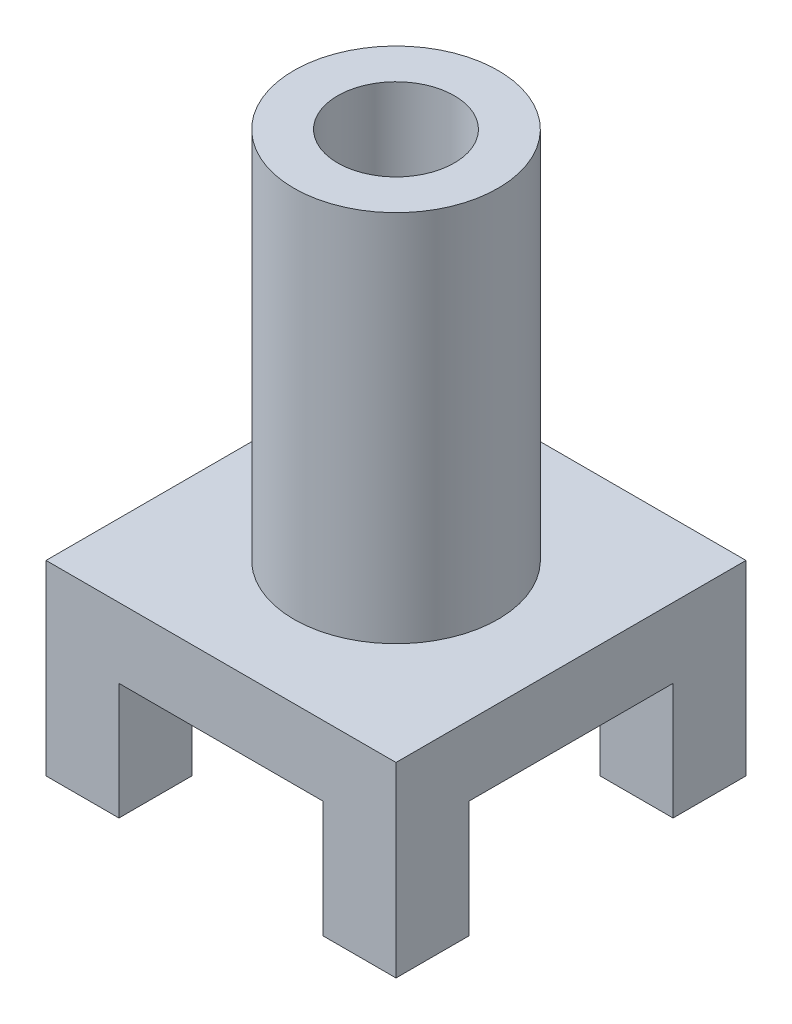
ISO-10303-21;
HEADER;
FILE_DESCRIPTION(('STEP AP214'),'2;1');
FILE_NAME('part.step','',(''),(''),'','','');
FILE_SCHEMA(('AUTOMOTIVE_DESIGN { 1 0 10303 214 1 1 1 1 }'));
ENDSEC;
DATA;
#1=APPLICATION_CONTEXT('core data for automotive mechanical design processes');
#2=APPLICATION_PROTOCOL_DEFINITION('international standard','automotive_design',2000,#1);
#3=PRODUCT_CONTEXT('',#1,'mechanical');
#4=PRODUCT('Part','Part','',(#3));
#5=PRODUCT_RELATED_PRODUCT_CATEGORY('part','',(#4));
#6=PRODUCT_DEFINITION_FORMATION('','',#4);
#7=PRODUCT_DEFINITION_CONTEXT('part definition',#1,'design');
#8=PRODUCT_DEFINITION('design','',#6,#7);
#9=PRODUCT_DEFINITION_SHAPE('','',#8);
#10=(LENGTH_UNIT() NAMED_UNIT(*) SI_UNIT(.MILLI.,.METRE.));
#11=(NAMED_UNIT(*) PLANE_ANGLE_UNIT() SI_UNIT($,.RADIAN.));
#12=(NAMED_UNIT(*) SI_UNIT($,.STERADIAN.) SOLID_ANGLE_UNIT());
#13=UNCERTAINTY_MEASURE_WITH_UNIT(LENGTH_MEASURE(1.E-05),#10,'distance_accuracy_value','');
#14=(GEOMETRIC_REPRESENTATION_CONTEXT(3) GLOBAL_UNCERTAINTY_ASSIGNED_CONTEXT((#13)) GLOBAL_UNIT_ASSIGNED_CONTEXT((#10,
#11,#12)) REPRESENTATION_CONTEXT('',''));
#15=CARTESIAN_POINT('',(0.,0.,0.));
#16=DIRECTION('',(0.,0.,1.));
#17=DIRECTION('',(1.,0.,0.));
#18=AXIS2_PLACEMENT_3D('',#15,#16,#17);
#19=CARTESIAN_POINT('',(0.,0.,0.));
#20=DIRECTION('',(0.,1.,0.));
#21=DIRECTION('',(0.,0.,1.));
#22=AXIS2_PLACEMENT_3D('',#19,#20,#21);
#23=PLANE('',#22);
#24=DIRECTION('',(0.,0.,1.));
#25=VECTOR('',#24,1.);
#26=CARTESIAN_POINT('',(-30.,0.,-30.));
#27=LINE('',#26,#25);
#28=CARTESIAN_POINT('',(-30.,0.,17.5));
#29=VERTEX_POINT('',#28);
#30=CARTESIAN_POINT('',(-30.,0.,30.));
#31=VERTEX_POINT('',#30);
#32=EDGE_CURVE('E173',#29,#31,#27,.T.);
#33=ORIENTED_EDGE('',*,*,#32,.F.);
#34=DIRECTION('',(1.,0.,0.));
#35=VECTOR('',#34,1.);
#36=CARTESIAN_POINT('',(-30.,0.,17.5));
#37=LINE('',#36,#35);
#38=CARTESIAN_POINT('',(-17.5,0.,17.5));
#39=VERTEX_POINT('',#38);
#40=EDGE_CURVE('E156',#29,#39,#37,.T.);
#41=ORIENTED_EDGE('',*,*,#40,.T.);
#42=DIRECTION('',(0.,0.,1.));
#43=VECTOR('',#42,1.);
#44=CARTESIAN_POINT('',(-17.5,0.,-30.));
#45=LINE('',#44,#43);
#46=CARTESIAN_POINT('',(-17.5,0.,30.));
#47=VERTEX_POINT('',#46);
#48=EDGE_CURVE('E246',#39,#47,#45,.T.);
#49=ORIENTED_EDGE('',*,*,#48,.T.);
#50=DIRECTION('',(1.,0.,0.));
#51=VECTOR('',#50,1.);
#52=CARTESIAN_POINT('',(-30.,0.,30.));
#53=LINE('',#52,#51);
#54=EDGE_CURVE('E184',#31,#47,#53,.T.);
#55=ORIENTED_EDGE('',*,*,#54,.F.);
#56=EDGE_LOOP('',(#33,#41,#49,#55));
#57=FACE_BOUND('',#56,.T.);
#58=ADVANCED_FACE('F41',(#57),#23,.F.);
#59=DIRECTION('',(0.,0.,1.));
#60=VECTOR('',#59,1.);
#61=CARTESIAN_POINT('',(17.5,0.,-30.));
#62=LINE('',#61,#60);
#63=CARTESIAN_POINT('',(17.5,0.,17.5));
#64=VERTEX_POINT('',#63);
#65=CARTESIAN_POINT('',(17.5,0.,30.));
#66=VERTEX_POINT('',#65);
#67=EDGE_CURVE('E228',#64,#66,#62,.T.);
#68=ORIENTED_EDGE('',*,*,#67,.F.);
#69=CARTESIAN_POINT('',(30.,0.,17.5));
#70=VERTEX_POINT('',#69);
#71=EDGE_CURVE('E168',#64,#70,#37,.T.);
#72=ORIENTED_EDGE('',*,*,#71,.T.);
#73=DIRECTION('',(0.,0.,-1.));
#74=VECTOR('',#73,1.);
#75=CARTESIAN_POINT('',(30.,0.,-30.));
#76=LINE('',#75,#74);
#77=CARTESIAN_POINT('',(30.,0.,30.));
#78=VERTEX_POINT('',#77);
#79=EDGE_CURVE('E262',#78,#70,#76,.T.);
#80=ORIENTED_EDGE('',*,*,#79,.F.);
#81=EDGE_CURVE('E192',#66,#78,#53,.T.);
#82=ORIENTED_EDGE('',*,*,#81,.F.);
#83=EDGE_LOOP('',(#68,#72,#80,#82));
#84=FACE_BOUND('',#83,.T.);
#85=ADVANCED_FACE('F236',(#84),#23,.F.);
#86=CARTESIAN_POINT('',(-17.5,0.,-30.));
#87=DIRECTION('',(-1.,0.,0.));
#88=DIRECTION('',(0.,0.,1.));
#89=AXIS2_PLACEMENT_3D('',#86,#87,#88);
#90=PLANE('',#89);
#91=ORIENTED_EDGE('',*,*,#48,.F.);
#92=DIRECTION('',(0.,1.,0.));
#93=VECTOR('',#92,1.);
#94=CARTESIAN_POINT('',(-17.5,0.,17.5));
#95=LINE('',#94,#93);
#96=CARTESIAN_POINT('',(-17.5,20.,17.5));
#97=VERTEX_POINT('',#96);
#98=EDGE_CURVE('E162',#39,#97,#95,.T.);
#99=ORIENTED_EDGE('',*,*,#98,.T.);
#100=DIRECTION('',(0.,0.,1.));
#101=VECTOR('',#100,1.);
#102=CARTESIAN_POINT('',(-17.5,20.,-30.));
#103=LINE('',#102,#101);
#104=CARTESIAN_POINT('',(-17.5,20.,30.));
#105=VERTEX_POINT('',#104);
#106=EDGE_CURVE('E276',#97,#105,#103,.T.);
#107=ORIENTED_EDGE('',*,*,#106,.T.);
#108=DIRECTION('',(0.,-1.,0.));
#109=VECTOR('',#108,1.);
#110=CARTESIAN_POINT('',(-17.5,0.,30.));
#111=LINE('',#110,#109);
#112=EDGE_CURVE('E289',#105,#47,#111,.T.);
#113=ORIENTED_EDGE('',*,*,#112,.T.);
#114=EDGE_LOOP('',(#91,#99,#107,#113));
#115=FACE_BOUND('',#114,.T.);
#116=ADVANCED_FACE('F396',(#115),#90,.F.);
#117=CARTESIAN_POINT('',(17.5,0.,-30.));
#118=DIRECTION('',(1.,0.,0.));
#119=DIRECTION('',(0.,0.,-1.));
#120=AXIS2_PLACEMENT_3D('',#117,#118,#119);
#121=PLANE('',#120);
#122=DIRECTION('',(0.,0.,1.));
#123=VECTOR('',#122,1.);
#124=CARTESIAN_POINT('',(17.5,20.,-30.));
#125=LINE('',#124,#123);
#126=CARTESIAN_POINT('',(17.5,20.,17.5));
#127=VERTEX_POINT('',#126);
#128=CARTESIAN_POINT('',(17.5,20.,30.));
#129=VERTEX_POINT('',#128);
#130=EDGE_CURVE('E230',#127,#129,#125,.T.);
#131=ORIENTED_EDGE('',*,*,#130,.F.);
#132=DIRECTION('',(0.,-1.,0.));
#133=VECTOR('',#132,1.);
#134=CARTESIAN_POINT('',(17.5,0.,17.5));
#135=LINE('',#134,#133);
#136=EDGE_CURVE('E45',#127,#64,#135,.T.);
#137=ORIENTED_EDGE('',*,*,#136,.T.);
#138=ORIENTED_EDGE('',*,*,#67,.T.);
#139=DIRECTION('',(0.,1.,0.));
#140=VECTOR('',#139,1.);
#141=CARTESIAN_POINT('',(17.5,0.,30.));
#142=LINE('',#141,#140);
#143=EDGE_CURVE('E286',#66,#129,#142,.T.);
#144=ORIENTED_EDGE('',*,*,#143,.T.);
#145=EDGE_LOOP('',(#131,#137,#138,#144));
#146=FACE_BOUND('',#145,.T.);
#147=ADVANCED_FACE('F226',(#146),#121,.F.);
#148=CARTESIAN_POINT('',(-17.5,0.,-30.));
#149=VERTEX_POINT('',#148);
#150=CARTESIAN_POINT('',(-17.5,0.,-17.5));
#151=VERTEX_POINT('',#150);
#152=EDGE_CURVE('E241',#149,#151,#45,.T.);
#153=ORIENTED_EDGE('',*,*,#152,.T.);
#154=DIRECTION('',(1.,0.,0.));
#155=VECTOR('',#154,1.);
#156=CARTESIAN_POINT('',(-30.,0.,-17.5));
#157=LINE('',#156,#155);
#158=CARTESIAN_POINT('',(-30.,0.,-17.5));
#159=VERTEX_POINT('',#158);
#160=EDGE_CURVE('E58',#159,#151,#157,.T.);
#161=ORIENTED_EDGE('',*,*,#160,.F.);
#162=CARTESIAN_POINT('',(-30.,0.,-30.));
#163=VERTEX_POINT('',#162);
#164=EDGE_CURVE('E186',#163,#159,#27,.T.);
#165=ORIENTED_EDGE('',*,*,#164,.F.);
#166=DIRECTION('',(-1.,0.,0.));
#167=VECTOR('',#166,1.);
#168=CARTESIAN_POINT('',(-30.,0.,-30.));
#169=LINE('',#168,#167);
#170=EDGE_CURVE('E194',#149,#163,#169,.T.);
#171=ORIENTED_EDGE('',*,*,#170,.F.);
#172=EDGE_LOOP('',(#153,#161,#165,#171));
#173=FACE_BOUND('',#172,.T.);
#174=ADVANCED_FACE('F404',(#173),#23,.F.);
#175=CARTESIAN_POINT('',(30.,32.,-30.));
#176=DIRECTION('',(-1.,0.,0.));
#177=DIRECTION('',(0.,0.,1.));
#178=AXIS2_PLACEMENT_3D('',#175,#176,#177);
#179=PLANE('',#178);
#180=ORIENTED_EDGE('',*,*,#79,.T.);
#181=DIRECTION('',(0.,-1.,0.));
#182=VECTOR('',#181,1.);
#183=CARTESIAN_POINT('',(30.,0.,17.5));
#184=LINE('',#183,#182);
#185=CARTESIAN_POINT('',(30.,20.,17.5));
#186=VERTEX_POINT('',#185);
#187=EDGE_CURVE('E325',#186,#70,#184,.T.);
#188=ORIENTED_EDGE('',*,*,#187,.F.);
#189=DIRECTION('',(0.,0.,1.));
#190=VECTOR('',#189,1.);
#191=CARTESIAN_POINT('',(30.,20.,17.5));
#192=LINE('',#191,#190);
#193=CARTESIAN_POINT('',(30.,20.,-17.5));
#194=VERTEX_POINT('',#193);
#195=EDGE_CURVE('E180',#194,#186,#192,.T.);
#196=ORIENTED_EDGE('',*,*,#195,.F.);
#197=DIRECTION('',(0.,1.,0.));
#198=VECTOR('',#197,1.);
#199=CARTESIAN_POINT('',(30.,0.,-17.5));
#200=LINE('',#199,#198);
#201=CARTESIAN_POINT('',(30.,0.,-17.5));
#202=VERTEX_POINT('',#201);
#203=EDGE_CURVE('E322',#202,#194,#200,.T.);
#204=ORIENTED_EDGE('',*,*,#203,.F.);
#205=CARTESIAN_POINT('',(30.,0.,-30.));
#206=VERTEX_POINT('',#205);
#207=EDGE_CURVE('E264',#202,#206,#76,.T.);
#208=ORIENTED_EDGE('',*,*,#207,.T.);
#209=DIRECTION('',(0.,-1.,0.));
#210=VECTOR('',#209,1.);
#211=CARTESIAN_POINT('',(30.,32.,-30.));
#212=LINE('',#211,#210);
#213=CARTESIAN_POINT('',(30.,32.,-30.));
#214=VERTEX_POINT('',#213);
#215=EDGE_CURVE('E213',#214,#206,#212,.T.);
#216=ORIENTED_EDGE('',*,*,#215,.F.);
#217=DIRECTION('',(0.,0.,-1.));
#218=VECTOR('',#217,1.);
#219=CARTESIAN_POINT('',(30.,32.,-30.));
#220=LINE('',#219,#218);
#221=CARTESIAN_POINT('',(30.,32.,30.));
#222=VERTEX_POINT('',#221);
#223=EDGE_CURVE('E200',#222,#214,#220,.T.);
#224=ORIENTED_EDGE('',*,*,#223,.F.);
#225=DIRECTION('',(0.,-1.,0.));
#226=VECTOR('',#225,1.);
#227=CARTESIAN_POINT('',(30.,32.,30.));
#228=LINE('',#227,#226);
#229=EDGE_CURVE('E201',#222,#78,#228,.T.);
#230=ORIENTED_EDGE('',*,*,#229,.T.);
#231=EDGE_LOOP('',(#180,#188,#196,#204,#208,#216,#224,#230));
#232=FACE_BOUND('',#231,.T.);
#233=ADVANCED_FACE('F43',(#232),#179,.F.);
#234=CARTESIAN_POINT('',(-30.,32.,-30.));
#235=DIRECTION('',(0.,0.,1.));
#236=DIRECTION('',(1.,0.,0.));
#237=AXIS2_PLACEMENT_3D('',#234,#235,#236);
#238=PLANE('',#237);
#239=DIRECTION('',(-1.,0.,0.));
#240=VECTOR('',#239,1.);
#241=CARTESIAN_POINT('',(-17.5,20.,-30.));
#242=LINE('',#241,#240);
#243=CARTESIAN_POINT('',(17.5,20.,-30.));
#244=VERTEX_POINT('',#243);
#245=CARTESIAN_POINT('',(-17.5,20.,-30.));
#246=VERTEX_POINT('',#245);
#247=EDGE_CURVE('E293',#244,#246,#242,.T.);
#248=ORIENTED_EDGE('',*,*,#247,.T.);
#249=DIRECTION('',(0.,-1.,0.));
#250=VECTOR('',#249,1.);
#251=CARTESIAN_POINT('',(-17.5,0.,-30.));
#252=LINE('',#251,#250);
#253=EDGE_CURVE('E285',#246,#149,#252,.T.);
#254=ORIENTED_EDGE('',*,*,#253,.T.);
#255=ORIENTED_EDGE('',*,*,#170,.T.);
#256=DIRECTION('',(0.,-1.,0.));
#257=VECTOR('',#256,1.);
#258=CARTESIAN_POINT('',(-30.,32.,-30.));
#259=LINE('',#258,#257);
#260=CARTESIAN_POINT('',(-30.,32.,-30.));
#261=VERTEX_POINT('',#260);
#262=EDGE_CURVE('E209',#261,#163,#259,.T.);
#263=ORIENTED_EDGE('',*,*,#262,.F.);
#264=DIRECTION('',(-1.,0.,0.));
#265=VECTOR('',#264,1.);
#266=CARTESIAN_POINT('',(-30.,32.,-30.));
#267=LINE('',#266,#265);
#268=EDGE_CURVE('E255',#214,#261,#267,.T.);
#269=ORIENTED_EDGE('',*,*,#268,.F.);
#270=ORIENTED_EDGE('',*,*,#215,.T.);
#271=CARTESIAN_POINT('',(17.5,0.,-30.));
#272=VERTEX_POINT('',#271);
#273=EDGE_CURVE('E187',#206,#272,#169,.T.);
#274=ORIENTED_EDGE('',*,*,#273,.T.);
#275=DIRECTION('',(0.,1.,0.));
#276=VECTOR('',#275,1.);
#277=CARTESIAN_POINT('',(17.5,0.,-30.));
#278=LINE('',#277,#276);
#279=EDGE_CURVE('E297',#272,#244,#278,.T.);
#280=ORIENTED_EDGE('',*,*,#279,.T.);
#281=EDGE_LOOP('',(#248,#254,#255,#263,#269,#270,#274,#280));
#282=FACE_BOUND('',#281,.T.);
#283=ADVANCED_FACE('F372',(#282),#238,.F.);
#284=CARTESIAN_POINT('',(-30.,32.,-30.));
#285=DIRECTION('',(1.,0.,0.));
#286=DIRECTION('',(0.,0.,-1.));
#287=AXIS2_PLACEMENT_3D('',#284,#285,#286);
#288=PLANE('',#287);
#289=DIRECTION('',(0.,0.,1.));
#290=VECTOR('',#289,1.);
#291=CARTESIAN_POINT('',(-30.,20.,17.5));
#292=LINE('',#291,#290);
#293=CARTESIAN_POINT('',(-30.,20.,-17.5));
#294=VERTEX_POINT('',#293);
#295=CARTESIAN_POINT('',(-30.,20.,17.5));
#296=VERTEX_POINT('',#295);
#297=EDGE_CURVE('E177',#294,#296,#292,.T.);
#298=ORIENTED_EDGE('',*,*,#297,.T.);
#299=DIRECTION('',(0.,-1.,0.));
#300=VECTOR('',#299,1.);
#301=CARTESIAN_POINT('',(-30.,0.,17.5));
#302=LINE('',#301,#300);
#303=EDGE_CURVE('E159',#296,#29,#302,.T.);
#304=ORIENTED_EDGE('',*,*,#303,.T.);
#305=ORIENTED_EDGE('',*,*,#32,.T.);
#306=DIRECTION('',(0.,-1.,0.));
#307=VECTOR('',#306,1.);
#308=CARTESIAN_POINT('',(-30.,32.,30.));
#309=LINE('',#308,#307);
#310=CARTESIAN_POINT('',(-30.,32.,30.));
#311=VERTEX_POINT('',#310);
#312=EDGE_CURVE('E205',#311,#31,#309,.T.);
#313=ORIENTED_EDGE('',*,*,#312,.F.);
#314=DIRECTION('',(0.,0.,1.));
#315=VECTOR('',#314,1.);
#316=CARTESIAN_POINT('',(-30.,32.,-30.));
#317=LINE('',#316,#315);
#318=EDGE_CURVE('E258',#261,#311,#317,.T.);
#319=ORIENTED_EDGE('',*,*,#318,.F.);
#320=ORIENTED_EDGE('',*,*,#262,.T.);
#321=ORIENTED_EDGE('',*,*,#164,.T.);
#322=DIRECTION('',(0.,1.,0.));
#323=VECTOR('',#322,1.);
#324=CARTESIAN_POINT('',(-30.,0.,-17.5));
#325=LINE('',#324,#323);
#326=EDGE_CURVE('E179',#159,#294,#325,.T.);
#327=ORIENTED_EDGE('',*,*,#326,.T.);
#328=EDGE_LOOP('',(#298,#304,#305,#313,#319,#320,#321,#327));
#329=FACE_BOUND('',#328,.T.);
#330=ADVANCED_FACE('F171',(#329),#288,.F.);
#331=CARTESIAN_POINT('',(-30.,32.,30.));
#332=DIRECTION('',(0.,0.,-1.));
#333=DIRECTION('',(-1.,0.,0.));
#334=AXIS2_PLACEMENT_3D('',#331,#332,#333);
#335=PLANE('',#334);
#336=ORIENTED_EDGE('',*,*,#54,.T.);
#337=ORIENTED_EDGE('',*,*,#112,.F.);
#338=DIRECTION('',(-1.,0.,0.));
#339=VECTOR('',#338,1.);
#340=CARTESIAN_POINT('',(-17.5,20.,30.));
#341=LINE('',#340,#339);
#342=EDGE_CURVE('E281',#129,#105,#341,.T.);
#343=ORIENTED_EDGE('',*,*,#342,.F.);
#344=ORIENTED_EDGE('',*,*,#143,.F.);
#345=ORIENTED_EDGE('',*,*,#81,.T.);
#346=ORIENTED_EDGE('',*,*,#229,.F.);
#347=DIRECTION('',(1.,0.,0.));
#348=VECTOR('',#347,1.);
#349=CARTESIAN_POINT('',(-30.,32.,30.));
#350=LINE('',#349,#348);
#351=EDGE_CURVE('E206',#311,#222,#350,.T.);
#352=ORIENTED_EDGE('',*,*,#351,.F.);
#353=ORIENTED_EDGE('',*,*,#312,.T.);
#354=EDGE_LOOP('',(#336,#337,#343,#344,#345,#346,#352,#353));
#355=FACE_BOUND('',#354,.T.);
#356=ADVANCED_FACE('F365',(#355),#335,.F.);
#357=CARTESIAN_POINT('',(0.,32.,0.));
#358=DIRECTION('',(0.,1.,0.));
#359=DIRECTION('',(0.,0.,1.));
#360=AXIS2_PLACEMENT_3D('',#357,#358,#359);
#361=PLANE('',#360);
#362=CARTESIAN_POINT('',(0.,32.,0.));
#363=DIRECTION('',(0.,1.,0.));
#364=DIRECTION('',(0.,0.,1.));
#365=AXIS2_PLACEMENT_3D('',#362,#363,#364);
#366=CIRCLE('',#365,17.5);
#367=CARTESIAN_POINT('',(0.,32.,17.5));
#368=VERTEX_POINT('',#367);
#369=EDGE_CURVE('E11',#368,#368,#366,.T.);
#370=ORIENTED_EDGE('',*,*,#369,.F.);
#371=EDGE_LOOP('',(#370));
#372=FACE_BOUND('',#371,.T.);
#373=ORIENTED_EDGE('',*,*,#223,.T.);
#374=ORIENTED_EDGE('',*,*,#268,.T.);
#375=ORIENTED_EDGE('',*,*,#318,.T.);
#376=ORIENTED_EDGE('',*,*,#351,.T.);
#377=EDGE_LOOP('',(#373,#374,#375,#376));
#378=FACE_BOUND('',#377,.T.);
#379=ADVANCED_FACE('F361',(#372,#378),#361,.T.);
#380=ORIENTED_EDGE('',*,*,#207,.F.);
#381=CARTESIAN_POINT('',(17.5,0.,-17.5));
#382=VERTEX_POINT('',#381);
#383=EDGE_CURVE('E167',#382,#202,#157,.T.);
#384=ORIENTED_EDGE('',*,*,#383,.F.);
#385=EDGE_CURVE('E240',#272,#382,#62,.T.);
#386=ORIENTED_EDGE('',*,*,#385,.F.);
#387=ORIENTED_EDGE('',*,*,#273,.F.);
#388=EDGE_LOOP('',(#380,#384,#386,#387));
#389=FACE_BOUND('',#388,.T.);
#390=ADVANCED_FACE('F364',(#389),#23,.F.);
#391=CARTESIAN_POINT('',(-17.5,20.,-17.5));
#392=VERTEX_POINT('',#391);
#393=EDGE_CURVE('E269',#246,#392,#103,.T.);
#394=ORIENTED_EDGE('',*,*,#393,.T.);
#395=DIRECTION('',(0.,-1.,0.));
#396=VECTOR('',#395,1.);
#397=CARTESIAN_POINT('',(-17.5,0.,-17.5));
#398=LINE('',#397,#396);
#399=EDGE_CURVE('E306',#392,#151,#398,.T.);
#400=ORIENTED_EDGE('',*,*,#399,.T.);
#401=ORIENTED_EDGE('',*,*,#152,.F.);
#402=ORIENTED_EDGE('',*,*,#253,.F.);
#403=EDGE_LOOP('',(#394,#400,#401,#402));
#404=FACE_BOUND('',#403,.T.);
#405=ADVANCED_FACE('F399',(#404),#90,.F.);
#406=CARTESIAN_POINT('',(-17.5,20.,-30.));
#407=DIRECTION('',(0.,1.,0.));
#408=DIRECTION('',(0.,0.,1.));
#409=AXIS2_PLACEMENT_3D('',#406,#407,#408);
#410=PLANE('',#409);
#411=CARTESIAN_POINT('',(0.,20.,0.));
#412=DIRECTION('',(0.,1.,0.));
#413=DIRECTION('',(0.,0.,1.));
#414=AXIS2_PLACEMENT_3D('',#411,#412,#413);
#415=CIRCLE('',#414,10.);
#416=CARTESIAN_POINT('',(0.,20.,10.));
#417=VERTEX_POINT('',#416);
#418=EDGE_CURVE('E336',#417,#417,#415,.T.);
#419=ORIENTED_EDGE('',*,*,#418,.T.);
#420=EDGE_LOOP('',(#419));
#421=FACE_BOUND('',#420,.T.);
#422=CARTESIAN_POINT('',(17.5,20.,-17.5));
#423=VERTEX_POINT('',#422);
#424=EDGE_CURVE('E249',#244,#423,#125,.T.);
#425=ORIENTED_EDGE('',*,*,#424,.T.);
#426=DIRECTION('',(1.,0.,0.));
#427=VECTOR('',#426,1.);
#428=CARTESIAN_POINT('',(-30.,20.,-17.5));
#429=LINE('',#428,#427);
#430=EDGE_CURVE('E66',#423,#194,#429,.T.);
#431=ORIENTED_EDGE('',*,*,#430,.T.);
#432=ORIENTED_EDGE('',*,*,#195,.T.);
#433=DIRECTION('',(1.,0.,0.));
#434=VECTOR('',#433,1.);
#435=CARTESIAN_POINT('',(-30.,20.,17.5));
#436=LINE('',#435,#434);
#437=EDGE_CURVE('E316',#127,#186,#436,.T.);
#438=ORIENTED_EDGE('',*,*,#437,.F.);
#439=ORIENTED_EDGE('',*,*,#130,.T.);
#440=ORIENTED_EDGE('',*,*,#342,.T.);
#441=ORIENTED_EDGE('',*,*,#106,.F.);
#442=EDGE_CURVE('E308',#296,#97,#436,.T.);
#443=ORIENTED_EDGE('',*,*,#442,.F.);
#444=ORIENTED_EDGE('',*,*,#297,.F.);
#445=EDGE_CURVE('E312',#294,#392,#429,.T.);
#446=ORIENTED_EDGE('',*,*,#445,.T.);
#447=ORIENTED_EDGE('',*,*,#393,.F.);
#448=ORIENTED_EDGE('',*,*,#247,.F.);
#449=EDGE_LOOP('',(#425,#431,#432,#438,#439,#440,#441,#443,#444,#446,#447,#448));
#450=FACE_BOUND('',#449,.T.);
#451=ADVANCED_FACE('F382',(#421,#450),#410,.F.);
#452=ORIENTED_EDGE('',*,*,#385,.T.);
#453=DIRECTION('',(0.,1.,0.));
#454=VECTOR('',#453,1.);
#455=CARTESIAN_POINT('',(17.5,0.,-17.5));
#456=LINE('',#455,#454);
#457=EDGE_CURVE('E216',#382,#423,#456,.T.);
#458=ORIENTED_EDGE('',*,*,#457,.T.);
#459=ORIENTED_EDGE('',*,*,#424,.F.);
#460=ORIENTED_EDGE('',*,*,#279,.F.);
#461=EDGE_LOOP('',(#452,#458,#459,#460));
#462=FACE_BOUND('',#461,.T.);
#463=ADVANCED_FACE('F386',(#462),#121,.F.);
#464=CARTESIAN_POINT('',(-30.,0.,-17.5));
#465=DIRECTION('',(0.,0.,-1.));
#466=DIRECTION('',(-1.,0.,0.));
#467=AXIS2_PLACEMENT_3D('',#464,#465,#466);
#468=PLANE('',#467);
#469=ORIENTED_EDGE('',*,*,#383,.T.);
#470=ORIENTED_EDGE('',*,*,#203,.T.);
#471=ORIENTED_EDGE('',*,*,#430,.F.);
#472=ORIENTED_EDGE('',*,*,#457,.F.);
#473=EDGE_LOOP('',(#469,#470,#471,#472));
#474=FACE_BOUND('',#473,.T.);
#475=ADVANCED_FACE('F422',(#474),#468,.F.);
#476=CARTESIAN_POINT('',(-30.,0.,17.5));
#477=DIRECTION('',(0.,0.,1.));
#478=DIRECTION('',(1.,0.,0.));
#479=AXIS2_PLACEMENT_3D('',#476,#477,#478);
#480=PLANE('',#479);
#481=ORIENTED_EDGE('',*,*,#437,.T.);
#482=ORIENTED_EDGE('',*,*,#187,.T.);
#483=ORIENTED_EDGE('',*,*,#71,.F.);
#484=ORIENTED_EDGE('',*,*,#136,.F.);
#485=EDGE_LOOP('',(#481,#482,#483,#484));
#486=FACE_BOUND('',#485,.T.);
#487=ADVANCED_FACE('F426',(#486),#480,.F.);
#488=ORIENTED_EDGE('',*,*,#40,.F.);
#489=ORIENTED_EDGE('',*,*,#303,.F.);
#490=ORIENTED_EDGE('',*,*,#442,.T.);
#491=ORIENTED_EDGE('',*,*,#98,.F.);
#492=EDGE_LOOP('',(#488,#489,#490,#491));
#493=FACE_BOUND('',#492,.T.);
#494=ADVANCED_FACE('F158',(#493),#480,.F.);
#495=ORIENTED_EDGE('',*,*,#445,.F.);
#496=ORIENTED_EDGE('',*,*,#326,.F.);
#497=ORIENTED_EDGE('',*,*,#160,.T.);
#498=ORIENTED_EDGE('',*,*,#399,.F.);
#499=EDGE_LOOP('',(#495,#496,#497,#498));
#500=FACE_BOUND('',#499,.T.);
#501=ADVANCED_FACE('F357',(#500),#468,.F.);
#502=CARTESIAN_POINT('',(0.,96.,0.));
#503=DIRECTION('',(0.,-1.,0.));
#504=DIRECTION('',(0.,0.,-1.));
#505=AXIS2_PLACEMENT_3D('',#502,#503,#504);
#506=CYLINDRICAL_SURFACE('',#505,17.5);
#507=CARTESIAN_POINT('',(0.,96.,0.));
#508=DIRECTION('',(0.,1.,0.));
#509=DIRECTION('',(0.,0.,1.));
#510=AXIS2_PLACEMENT_3D('',#507,#508,#509);
#511=CIRCLE('',#510,17.5);
#512=CARTESIAN_POINT('',(0.,96.,17.5));
#513=VERTEX_POINT('',#512);
#514=EDGE_CURVE('E328',#513,#513,#511,.T.);
#515=ORIENTED_EDGE('',*,*,#514,.F.);
#516=EDGE_LOOP('',(#515));
#517=FACE_BOUND('',#516,.T.);
#518=ORIENTED_EDGE('',*,*,#369,.T.);
#519=EDGE_LOOP('',(#518));
#520=FACE_BOUND('',#519,.T.);
#521=ADVANCED_FACE('F351',(#517,#520),#506,.T.);
#522=CARTESIAN_POINT('',(0.,96.,0.));
#523=DIRECTION('',(0.,1.,0.));
#524=DIRECTION('',(0.,0.,1.));
#525=AXIS2_PLACEMENT_3D('',#522,#523,#524);
#526=PLANE('',#525);
#527=CARTESIAN_POINT('',(0.,96.,0.));
#528=DIRECTION('',(0.,1.,0.));
#529=DIRECTION('',(0.,0.,1.));
#530=AXIS2_PLACEMENT_3D('',#527,#528,#529);
#531=CIRCLE('',#530,10.);
#532=CARTESIAN_POINT('',(0.,96.,10.));
#533=VERTEX_POINT('',#532);
#534=EDGE_CURVE('E340',#533,#533,#531,.T.);
#535=ORIENTED_EDGE('',*,*,#534,.F.);
#536=EDGE_LOOP('',(#535));
#537=FACE_BOUND('',#536,.T.);
#538=ORIENTED_EDGE('',*,*,#514,.T.);
#539=EDGE_LOOP('',(#538));
#540=FACE_BOUND('',#539,.T.);
#541=ADVANCED_FACE('F348',(#537,#540),#526,.T.);
#542=CARTESIAN_POINT('',(0.,0.,0.));
#543=DIRECTION('',(0.,1.,0.));
#544=DIRECTION('',(0.,0.,1.));
#545=AXIS2_PLACEMENT_3D('',#542,#543,#544);
#546=CYLINDRICAL_SURFACE('',#545,10.);
#547=ORIENTED_EDGE('',*,*,#534,.T.);
#548=EDGE_LOOP('',(#547));
#549=FACE_BOUND('',#548,.T.);
#550=ORIENTED_EDGE('',*,*,#418,.F.);
#551=EDGE_LOOP('',(#550));
#552=FACE_BOUND('',#551,.T.);
#553=ADVANCED_FACE('F345',(#549,#552),#546,.F.);
#554=CLOSED_SHELL('',(#58,#85,#116,#147,#174,#233,#283,#330,#356,#379,#390,#405,#451,#463,#475,
#487,#494,#501,#521,#541,#553));
#555=MANIFOLD_SOLID_BREP('B2',#554);
#556=ADVANCED_BREP_SHAPE_REPRESENTATION('',(#18,#555),#14);
#557=SHAPE_DEFINITION_REPRESENTATION(#9,#556);
ENDSEC;
END-ISO-10303-21;
